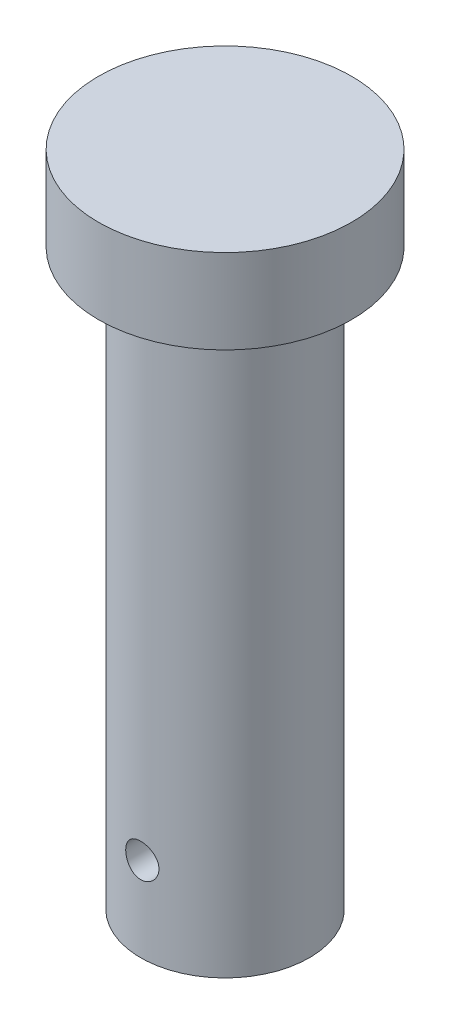
ISO-10303-21;
HEADER;
FILE_DESCRIPTION(('STEP AP214'),'2;1');
FILE_NAME('part.step','',(''),(''),'','','');
FILE_SCHEMA(('AUTOMOTIVE_DESIGN { 1 0 10303 214 1 1 1 1 }'));
ENDSEC;
DATA;
#1=APPLICATION_CONTEXT('core data for automotive mechanical design processes');
#2=APPLICATION_PROTOCOL_DEFINITION('international standard','automotive_design',2000,#1);
#3=PRODUCT_CONTEXT('',#1,'mechanical');
#4=PRODUCT('Part','Part','',(#3));
#5=PRODUCT_RELATED_PRODUCT_CATEGORY('part','',(#4));
#6=PRODUCT_DEFINITION_FORMATION('','',#4);
#7=PRODUCT_DEFINITION_CONTEXT('part definition',#1,'design');
#8=PRODUCT_DEFINITION('design','',#6,#7);
#9=PRODUCT_DEFINITION_SHAPE('','',#8);
#10=(LENGTH_UNIT() NAMED_UNIT(*) SI_UNIT(.MILLI.,.METRE.));
#11=(NAMED_UNIT(*) PLANE_ANGLE_UNIT() SI_UNIT($,.RADIAN.));
#12=(NAMED_UNIT(*) SI_UNIT($,.STERADIAN.) SOLID_ANGLE_UNIT());
#13=UNCERTAINTY_MEASURE_WITH_UNIT(LENGTH_MEASURE(1.E-05),#10,'distance_accuracy_value','');
#14=(GEOMETRIC_REPRESENTATION_CONTEXT(3) GLOBAL_UNCERTAINTY_ASSIGNED_CONTEXT((#13)) GLOBAL_UNIT_ASSIGNED_CONTEXT((#10,
#11,#12)) REPRESENTATION_CONTEXT('',''));
#15=CARTESIAN_POINT('',(0.,0.,0.));
#16=DIRECTION('',(0.,0.,1.));
#17=DIRECTION('',(1.,0.,0.));
#18=AXIS2_PLACEMENT_3D('',#15,#16,#17);
#19=CARTESIAN_POINT('',(0.,-15.,0.));
#20=DIRECTION('',(0.,1.,0.));
#21=DIRECTION('',(0.,0.,1.));
#22=AXIS2_PLACEMENT_3D('',#19,#20,#21);
#23=CYLINDRICAL_SURFACE('',#22,22.5);
#24=CARTESIAN_POINT('',(0.,-15.,0.));
#25=DIRECTION('',(0.,1.,0.));
#26=DIRECTION('',(0.,0.,1.));
#27=AXIS2_PLACEMENT_3D('',#24,#25,#26);
#28=CIRCLE('',#27,22.5);
#29=CARTESIAN_POINT('',(0.,-15.,22.5));
#30=VERTEX_POINT('',#29);
#31=EDGE_CURVE('E49',#30,#30,#28,.T.);
#32=ORIENTED_EDGE('',*,*,#31,.T.);
#33=EDGE_LOOP('',(#32));
#34=FACE_BOUND('',#33,.T.);
#35=CARTESIAN_POINT('',(0.,0.,0.));
#36=DIRECTION('',(0.,1.,0.));
#37=DIRECTION('',(0.,0.,1.));
#38=AXIS2_PLACEMENT_3D('',#35,#36,#37);
#39=CIRCLE('',#38,22.5);
#40=CARTESIAN_POINT('',(0.,0.,22.5));
#41=VERTEX_POINT('',#40);
#42=EDGE_CURVE('E54',#41,#41,#39,.T.);
#43=ORIENTED_EDGE('',*,*,#42,.F.);
#44=EDGE_LOOP('',(#43));
#45=FACE_BOUND('',#44,.T.);
#46=ADVANCED_FACE('F37',(#34,#45),#23,.T.);
#47=CARTESIAN_POINT('',(0.,-15.,0.));
#48=DIRECTION('',(0.,1.,0.));
#49=DIRECTION('',(0.,0.,1.));
#50=AXIS2_PLACEMENT_3D('',#47,#48,#49);
#51=PLANE('',#50);
#52=CARTESIAN_POINT('',(0.,-15.,0.));
#53=DIRECTION('',(0.,-1.,0.));
#54=DIRECTION('',(0.,0.,-1.));
#55=AXIS2_PLACEMENT_3D('',#52,#53,#54);
#56=CIRCLE('',#55,15.);
#57=CARTESIAN_POINT('',(0.,-15.,-15.));
#58=VERTEX_POINT('',#57);
#59=EDGE_CURVE('E10',#58,#58,#56,.T.);
#60=ORIENTED_EDGE('',*,*,#59,.F.);
#61=EDGE_LOOP('',(#60));
#62=FACE_BOUND('',#61,.T.);
#63=ORIENTED_EDGE('',*,*,#31,.F.);
#64=EDGE_LOOP('',(#63));
#65=FACE_BOUND('',#64,.T.);
#66=ADVANCED_FACE('F85',(#62,#65),#51,.F.);
#67=CARTESIAN_POINT('',(0.,0.,0.));
#68=DIRECTION('',(0.,1.,0.));
#69=DIRECTION('',(0.,0.,1.));
#70=AXIS2_PLACEMENT_3D('',#67,#68,#69);
#71=PLANE('',#70);
#72=ORIENTED_EDGE('',*,*,#42,.T.);
#73=EDGE_LOOP('',(#72));
#74=FACE_BOUND('',#73,.T.);
#75=ADVANCED_FACE('F81',(#74),#71,.T.);
#76=CARTESIAN_POINT('',(0.,-117.,0.));
#77=DIRECTION('',(0.,1.,0.));
#78=DIRECTION('',(0.,0.,1.));
#79=AXIS2_PLACEMENT_3D('',#76,#77,#78);
#80=CYLINDRICAL_SURFACE('',#79,15.);
#81=CARTESIAN_POINT('',(0.,-104.957727644723,15.));
#82=CARTESIAN_POINT('',(-0.164429762703568,-104.957721539506,14.9999969783956));
#83=CARTESIAN_POINT('',(-0.328937217951617,-104.943969531095,14.9972684973865));
#84=CARTESIAN_POINT('',(-0.653305463028808,-104.889366620122,14.98664718115));
#85=CARTESIAN_POINT('',(-0.813162399744395,-104.8484938791,14.9787501841422));
#86=CARTESIAN_POINT('',(-1.12349259764611,-104.740958574944,14.9586740107421));
#87=CARTESIAN_POINT('',(-1.27397457314733,-104.674320389779,14.9464988830924));
#88=CARTESIAN_POINT('',(-1.56161098639774,-104.517217514836,14.9191913739829));
#89=CARTESIAN_POINT('',(-1.69876628247248,-104.426754360937,14.9040591831667));
#90=CARTESIAN_POINT('',(-1.95767519049551,-104.223304857174,14.8722810668463));
#91=CARTESIAN_POINT('',(-2.07922779747335,-104.11006514638,14.8556193758809));
#92=CARTESIAN_POINT('',(-2.30174078216659,-103.86482171818,14.8227753637943));
#93=CARTESIAN_POINT('',(-2.40269958218777,-103.732816564464,14.8065930794815));
#94=CARTESIAN_POINT('',(-2.58201016361024,-103.452349378013,14.7763863160128));
#95=CARTESIAN_POINT('',(-2.66015465738132,-103.303752441489,14.7623821315543));
#96=CARTESIAN_POINT('',(-2.79029066016926,-102.99521626712,14.7383406710627));
#97=CARTESIAN_POINT('',(-2.84228467646827,-102.835278118336,14.7283030147426));
#98=CARTESIAN_POINT('',(-2.91799297600447,-102.510759485818,14.7134904297326));
#99=CARTESIAN_POINT('',(-2.94205943912988,-102.346264213014,14.7086500208323));
#100=CARTESIAN_POINT('',(-2.96232320225984,-102.015504921329,14.7045828126538));
#101=CARTESIAN_POINT('',(-2.95852327061579,-101.849241079783,14.7053554557541));
#102=CARTESIAN_POINT('',(-2.92344704313311,-101.522235075084,14.7123675309011));
#103=CARTESIAN_POINT('',(-2.89257371847963,-101.361447712127,14.7185267829031));
#104=CARTESIAN_POINT('',(-2.80486282378785,-101.047380352276,14.7354919054495));
#105=CARTESIAN_POINT('',(-2.74802404516114,-100.894100705203,14.746297992284));
#106=CARTESIAN_POINT('',(-2.60960876363205,-100.598234414841,14.7714216107408));
#107=CARTESIAN_POINT('',(-2.52787184900238,-100.455724820119,14.7857617936271));
#108=CARTESIAN_POINT('',(-2.34209375002007,-100.186292698215,14.8163231848474));
#109=CARTESIAN_POINT('',(-2.23805007126318,-100.059371916715,14.8325446034533));
#110=CARTESIAN_POINT('',(-2.00845081965847,-99.8223942982829,14.8653885424863));
#111=CARTESIAN_POINT('',(-1.88255114286223,-99.7126708648714,14.8820131189499));
#112=CARTESIAN_POINT('',(-1.61395905112776,-99.5158484692593,14.9135304483469));
#113=CARTESIAN_POINT('',(-1.47126643224587,-99.4287497818686,14.9284231802434));
#114=CARTESIAN_POINT('',(-1.17277384201991,-99.2795905203176,14.95483385433));
#115=CARTESIAN_POINT('',(-1.01695474837433,-99.2175672650864,14.9663467595141));
#116=CARTESIAN_POINT('',(-0.696831108593165,-99.1206707017916,14.9846622059237));
#117=CARTESIAN_POINT('',(-0.532527563503963,-99.0857941985607,14.9914653014824));
#118=CARTESIAN_POINT('',(-0.202964823487235,-99.0446513393358,14.999517648198));
#119=CARTESIAN_POINT('',(-0.0377647018837294,-99.0379285906137,15.0008554862988));
#120=CARTESIAN_POINT('',(0.291398500388813,-99.0520560813199,14.9980723261508));
#121=CARTESIAN_POINT('',(0.455361648074105,-99.0729048160451,14.9939516257995));
#122=CARTESIAN_POINT('',(0.775929945378207,-99.1412042187964,14.9807697678069));
#123=CARTESIAN_POINT('',(0.932586768229074,-99.1884214586134,14.9717519808725));
#124=CARTESIAN_POINT('',(1.23575982601254,-99.30786303916,14.9497832914876));
#125=CARTESIAN_POINT('',(1.38227531624742,-99.3800892140115,14.9368321005752));
#126=CARTESIAN_POINT('',(1.66293676310237,-99.5484910177694,14.9082124924983));
#127=CARTESIAN_POINT('',(1.79691409677689,-99.6449423664699,14.8925134715054));
#128=CARTESIAN_POINT('',(2.04694571408614,-99.858686537082,14.860213155956));
#129=CARTESIAN_POINT('',(2.16299813131545,-99.9759815265759,14.8436117676849));
#130=CARTESIAN_POINT('',(2.37564078883636,-100.230158458809,14.811080273944));
#131=CARTESIAN_POINT('',(2.47191813212078,-100.36730419957,14.7951637112293));
#132=CARTESIAN_POINT('',(2.64007030276637,-100.656089423476,14.7660875184461));
#133=CARTESIAN_POINT('',(2.71194609175713,-100.807728335165,14.7529277797432));
#134=CARTESIAN_POINT('',(2.82882386391464,-101.120441468184,14.7309638925047));
#135=CARTESIAN_POINT('',(2.87396307738656,-101.281462765743,14.7221375427749));
#136=CARTESIAN_POINT('',(2.93650425896489,-101.608996510998,14.7097918777426));
#137=CARTESIAN_POINT('',(2.95390973029608,-101.775508262447,14.7062718921627));
#138=CARTESIAN_POINT('',(2.96036254376128,-102.106156452043,14.7049739779993));
#139=CARTESIAN_POINT('',(2.94990410896268,-102.270283052701,14.7070959759879));
#140=CARTESIAN_POINT('',(2.90201473433925,-102.594388638095,14.7166197295045));
#141=CARTESIAN_POINT('',(2.86458399785906,-102.754367654091,14.7240214452286));
#142=CARTESIAN_POINT('',(2.76403028604823,-103.065333596948,14.7432264982441));
#143=CARTESIAN_POINT('',(2.70096628434303,-103.216340258258,14.7550197269349));
#144=CARTESIAN_POINT('',(2.55099228562529,-103.505707217763,14.7816850860109));
#145=CARTESIAN_POINT('',(2.46408036079252,-103.644066492363,14.7965574652847));
#146=CARTESIAN_POINT('',(2.2671826400287,-103.906675531526,14.8280126105233));
#147=CARTESIAN_POINT('',(2.15683928363284,-104.030654355489,14.8446195792397));
#148=CARTESIAN_POINT('',(1.91695089353176,-104.258499975465,14.8774973302073));
#149=CARTESIAN_POINT('',(1.78740145435718,-104.362362144503,14.8937680343482));
#150=CARTESIAN_POINT('',(1.51120362080295,-104.548016530209,14.9243339529687));
#151=CARTESIAN_POINT('',(1.36439543032479,-104.629574724575,14.9386075055722));
#152=CARTESIAN_POINT('',(1.05891908852499,-104.766734949452,14.9633580973518));
#153=CARTESIAN_POINT('',(0.900261884816328,-104.822360603771,14.9738385899433));
#154=CARTESIAN_POINT('',(0.617685273557066,-104.895182899716,14.9877628240101));
#155=CARTESIAN_POINT('',(0.495384830510255,-104.918595765881,14.9923251277991));
#156=CARTESIAN_POINT('',(0.248737704502875,-104.949870212072,14.9984448131895));
#157=CARTESIAN_POINT('',(0.124391083660607,-104.957732263318,15.0000022858432));
#158=CARTESIAN_POINT('',(0.,-104.957727644723,15.));
#159=B_SPLINE_CURVE_WITH_KNOTS('',3,(#81,#82,#83,#84,#85,#86,#87,#88,#89,#90,#91,#92,#93,#94,
#95,#96,#97,#98,#99,#100,#101,#102,#103,#104,#105,#106,#107,#108,#109,#110,#111,#112,#113,#114,
#115,#116,#117,#118,#119,#120,#121,#122,#123,#124,#125,#126,#127,#128,#129,#130,#131,#132,#133,
#134,#135,#136,#137,#138,#139,#140,#141,#142,#143,#144,#145,#146,#147,#148,#149,#150,#151,#152,
#153,#154,#155,#156,#157,#158),.UNSPECIFIED.,.T.,.F.,(4,2,2,2,2,2,2,2,2,2,2,2,2,2,2,2,2,2,2,2,2,
2,2,2,2,2,2,2,2,2,2,2,2,2,2,2,2,2,4),(0.,0.492834264042845,0.986065855974396,1.47883191442094,
1.97156621443524,2.47011920947099,2.96871038438328,3.47169994914731,3.97464127856723,
4.47116888255913,4.96764716031901,5.45685874578532,5.94609310442189,6.43854863220499,
6.9310592564795,7.43217529170698,7.93329741341901,8.4351626170659,8.93696874234351,
9.43060796348266,9.92422024556379,10.4135305341744,10.9028767157528,11.3980670148393,
11.893308840175,12.3958680587874,12.898407469976,13.3983446388236,13.8982186524302,
14.389285667666,14.8803489807781,15.3702888580805,15.8602683528541,16.3583447168935,
16.8565355063959,17.3597687575443,17.862542677315,18.2353830006376,18.6082120260002),.UNSPECIFIED.);
#160=CARTESIAN_POINT('',(0.,-104.957727644723,15.));
#161=VERTEX_POINT('',#160);
#162=EDGE_CURVE('E40',#161,#161,#159,.T.);
#163=ORIENTED_EDGE('',*,*,#162,.T.);
#164=EDGE_LOOP('',(#163));
#165=FACE_BOUND('',#164,.T.);
#166=CARTESIAN_POINT('',(2.95772764472291,-102.,-14.7055039757107));
#167=CARTESIAN_POINT('',(2.95772151235872,-101.835605266257,-14.7055072277227));
#168=CARTESIAN_POINT('',(2.9439751642968,-101.671132766623,-14.7082906242497));
#169=CARTESIAN_POINT('',(2.88939677329249,-101.346837103459,-14.7191076941596));
#170=CARTESIAN_POINT('',(2.84854275689802,-101.187017821622,-14.7271456267868));
#171=CARTESIAN_POINT('',(2.74106219566991,-100.876767368272,-14.7475268313589));
#172=CARTESIAN_POINT('',(2.67446090876237,-100.726327163376,-14.7598658827682));
#173=CARTESIAN_POINT('',(2.51744501134768,-100.438761162988,-14.7874540113259));
#174=CARTESIAN_POINT('',(2.42703185146071,-100.301634557127,-14.8027029111908));
#175=CARTESIAN_POINT('',(2.22363358969905,-100.04269501768,-14.8346267902051));
#176=CARTESIAN_POINT('',(2.11038390074475,-99.9210917676743,-14.851317035694));
#177=CARTESIAN_POINT('',(1.86509902445478,-99.6984805370882,-14.8841085627414));
#178=CARTESIAN_POINT('',(1.73306254100263,-99.5974739786618,-14.9002098035674));
#179=CARTESIAN_POINT('',(1.45256615847561,-99.4181120183513,-14.9301735441717));
#180=CARTESIAN_POINT('',(1.3039767419017,-99.3399555181721,-14.9440159473022));
#181=CARTESIAN_POINT('',(0.995456834880819,-99.2097952665508,-14.9677309966299));
#182=CARTESIAN_POINT('',(0.835527377604887,-99.157789136079,-14.9776040039265));
#183=CARTESIAN_POINT('',(0.511042554233899,-99.0820576261355,-14.9921599938816));
#184=CARTESIAN_POINT('',(0.346572754367269,-99.0579783049086,-14.9969078771534));
#185=CARTESIAN_POINT('',(0.0158638717917193,-99.0376799896667,-15.0009027045272));
#186=CARTESIAN_POINT('',(-0.150375043541105,-99.0414583830247,-15.0001501644848));
#187=CARTESIAN_POINT('',(-0.477472235702361,-99.0764990986108,-14.9932793248637));
#188=CARTESIAN_POINT('',(-0.638373141529377,-99.1073802027706,-14.9872354543394));
#189=CARTESIAN_POINT('',(-0.952663507568847,-99.1951454740803,-14.9705448770813));
#190=CARTESIAN_POINT('',(-1.10605267298639,-99.2520306608449,-14.9598979898651));
#191=CARTESIAN_POINT('',(-1.40205713832686,-99.390544818822,-14.9350746023641));
#192=CARTESIAN_POINT('',(-1.54460036178063,-99.4723238424606,-14.9208767934537));
#193=CARTESIAN_POINT('',(-1.81408217829891,-99.6581933433354,-14.8905178671145));
#194=CARTESIAN_POINT('',(-1.94101902120014,-99.7622863193646,-14.8743565298909));
#195=CARTESIAN_POINT('',(-2.17794630455735,-99.9919224110071,-14.841533656775));
#196=CARTESIAN_POINT('',(-2.28761311504644,-100.117799132144,-14.8248682855269));
#197=CARTESIAN_POINT('',(-2.4843319464592,-100.386324495414,-14.793175882623));
#198=CARTESIAN_POINT('',(-2.5713835632048,-100.528973437233,-14.7781488802508));
#199=CARTESIAN_POINT('',(-2.72050806187286,-100.827450498792,-14.7514275333814));
#200=CARTESIAN_POINT('',(-2.782529792507,-100.983304827057,-14.7397400275887));
#201=CARTESIAN_POINT('',(-2.87941269127652,-101.303505576366,-14.7211222708896));
#202=CARTESIAN_POINT('',(-2.91427729158976,-101.467850921497,-14.71419141884));
#203=CARTESIAN_POINT('',(-2.95537514793099,-101.797438783663,-14.7059917925037));
#204=CARTESIAN_POINT('',(-2.96207520021066,-101.962620860603,-14.704630715514));
#205=CARTESIAN_POINT('',(-2.94790876538758,-102.291742674716,-14.7074771588446));
#206=CARTESIAN_POINT('',(-2.9270437949743,-102.455682479742,-14.7116843727852));
#207=CARTESIAN_POINT('',(-2.8587416349198,-102.776105029791,-14.725107018805));
#208=CARTESIAN_POINT('',(-2.8115527745404,-102.932642848633,-14.7342756232045));
#209=CARTESIAN_POINT('',(-2.69220740769233,-103.235590335042,-14.7565470829625));
#210=CARTESIAN_POINT('',(-2.62004889375847,-103.381999187142,-14.7696502546341));
#211=CARTESIAN_POINT('',(-2.45175179030856,-103.662578513269,-14.7985224703131));
#212=CARTESIAN_POINT('',(-2.35532047035108,-103.7965700739,-14.8143232387296));
#213=CARTESIAN_POINT('',(-2.14160633393567,-104.046639600231,-14.8467227529766));
#214=CARTESIAN_POINT('',(-2.02432143429906,-104.162715774098,-14.8633215784084));
#215=CARTESIAN_POINT('',(-1.77013635022612,-104.375423410784,-14.8957458255757));
#216=CARTESIAN_POINT('',(-1.63297012208992,-104.471739641034,-14.9115560530889));
#217=CARTESIAN_POINT('',(-1.3441322317724,-104.63995996442,-14.9403594898874));
#218=CARTESIAN_POINT('',(-1.19246116793355,-104.71186506399,-14.9533528153012));
#219=CARTESIAN_POINT('',(-0.879757414369861,-104.828759662097,-14.9749934667917));
#220=CARTESIAN_POINT('',(-0.718782454108568,-104.873898925562,-14.9836649309218));
#221=CARTESIAN_POINT('',(-0.391347537330154,-104.936455855794,-14.9957882230221));
#222=CARTESIAN_POINT('',(-0.224888224404987,-104.953876763582,-14.9992406612345));
#223=CARTESIAN_POINT('',(0.105776459406181,-104.960379866901,-15.000523005487));
#224=CARTESIAN_POINT('',(0.269972320315214,-104.949936497404,-14.9984470427602));
#225=CARTESIAN_POINT('',(0.594220450132768,-104.902053090502,-14.9891032215817));
#226=CARTESIAN_POINT('',(0.754272768156698,-104.86461337325,-14.9818354247004));
#227=CARTESIAN_POINT('',(1.06540522685844,-104.764008427941,-14.9629265882197));
#228=CARTESIAN_POINT('',(1.21650392720705,-104.700898711958,-14.951294989649));
#229=CARTESIAN_POINT('',(1.50603626709698,-104.550804456797,-14.9249125156968));
#230=CARTESIAN_POINT('',(1.64446893916808,-104.463818095874,-14.9101614023216));
#231=CARTESIAN_POINT('',(1.90708973559056,-104.266831839445,-14.8788707403989));
#232=CARTESIAN_POINT('',(2.03101979866401,-104.156491745918,-14.8623067280702));
#233=CARTESIAN_POINT('',(2.2587685543338,-103.916630787099,-14.8294045042404));
#234=CARTESIAN_POINT('',(2.36258248583683,-103.787105393793,-14.8130663470424));
#235=CARTESIAN_POINT('',(2.54817667867073,-103.510933230536,-14.7822786572715));
#236=CARTESIAN_POINT('',(2.6297162110002,-103.364122198868,-14.7678505657997));
#237=CARTESIAN_POINT('',(2.76684079116723,-103.058641487174,-14.7427775611024));
#238=CARTESIAN_POINT('',(2.822449604818,-102.899982821015,-14.7321291858682));
#239=CARTESIAN_POINT('',(2.89523096286328,-102.617449455229,-14.7179687842091));
#240=CARTESIAN_POINT('',(2.91862569554854,-102.495196362829,-14.7133231696242));
#241=CARTESIAN_POINT('',(2.94987610160323,-102.248643632285,-14.7070895854962));
#242=CARTESIAN_POINT('',(2.95773228308968,-102.124344061196,-14.7055015159701));
#243=CARTESIAN_POINT('',(2.95772764472291,-102.,-14.7055039757107));
#244=B_SPLINE_CURVE_WITH_KNOTS('',3,(#166,#167,#168,#169,#170,#171,#172,#173,#174,#175,#176,
#177,#178,#179,#180,#181,#182,#183,#184,#185,#186,#187,#188,#189,#190,#191,#192,#193,#194,#195,
#196,#197,#198,#199,#200,#201,#202,#203,#204,#205,#206,#207,#208,#209,#210,#211,#212,#213,#214,
#215,#216,#217,#218,#219,#220,#221,#222,#223,#224,#225,#226,#227,#228,#229,#230,#231,#232,#233,
#234,#235,#236,#237,#238,#239,#240,#241,#242,#243),.UNSPECIFIED.,.T.,.F.,(4,2,2,2,2,2,2,2,2,2,2,
2,2,2,2,2,2,2,2,2,2,2,2,2,2,2,2,2,2,2,2,2,2,2,2,2,2,2,4),(0.,0.492728976055596,
0.985857846519529,1.47850418292867,1.97112051424421,2.46981130010515,2.96853650775338,
3.47148182572244,3.97438137996642,4.47083507090189,4.96724220267561,5.45677695888751,
5.94633091130264,6.43889622507154,6.93151672683936,7.43248527229111,7.93346277042175,
8.4354589481931,8.93739167228497,9.43097179134234,9.92452475364359,10.4134986024393,
10.9025117720097,11.397731477097,11.8930006802246,12.3956436919607,12.8982659779846,
13.3980486950708,13.8977729698137,14.3890431465077,14.8803074972709,15.3705150762895,
15.8607600676666,16.3587098050235,16.856777253736,17.3600318155276,17.8628242275321,
18.2355242778417,18.6082121405044),.UNSPECIFIED.);
#245=CARTESIAN_POINT('',(2.95772764472291,-102.,-14.7055039757107));
#246=VERTEX_POINT('',#245);
#247=EDGE_CURVE('E60',#246,#246,#244,.T.);
#248=ORIENTED_EDGE('',*,*,#247,.T.);
#249=EDGE_LOOP('',(#248));
#250=FACE_BOUND('',#249,.T.);
#251=CARTESIAN_POINT('',(0.,-117.,0.));
#252=DIRECTION('',(0.,-1.,0.));
#253=DIRECTION('',(0.,0.,-1.));
#254=AXIS2_PLACEMENT_3D('',#251,#252,#253);
#255=CIRCLE('',#254,15.);
#256=CARTESIAN_POINT('',(0.,-117.,-15.));
#257=VERTEX_POINT('',#256);
#258=EDGE_CURVE('E57',#257,#257,#255,.T.);
#259=ORIENTED_EDGE('',*,*,#258,.F.);
#260=EDGE_LOOP('',(#259));
#261=FACE_BOUND('',#260,.T.);
#262=ORIENTED_EDGE('',*,*,#59,.T.);
#263=EDGE_LOOP('',(#262));
#264=FACE_BOUND('',#263,.T.);
#265=ADVANCED_FACE('F65',(#165,#250,#261,#264),#80,.T.);
#266=CARTESIAN_POINT('',(0.,-117.,0.));
#267=DIRECTION('',(0.,-1.,0.));
#268=DIRECTION('',(0.,0.,-1.));
#269=AXIS2_PLACEMENT_3D('',#266,#267,#268);
#270=PLANE('',#269);
#271=ORIENTED_EDGE('',*,*,#258,.T.);
#272=EDGE_LOOP('',(#271));
#273=FACE_BOUND('',#272,.T.);
#274=ADVANCED_FACE('F72',(#273),#270,.T.);
#275=CARTESIAN_POINT('',(0.,-102.,-48.5));
#276=DIRECTION('',(0.,0.,1.));
#277=DIRECTION('',(1.,0.,0.));
#278=AXIS2_PLACEMENT_3D('',#275,#276,#277);
#279=CYLINDRICAL_SURFACE('',#278,2.95772764472291);
#280=ORIENTED_EDGE('',*,*,#247,.F.);
#281=EDGE_LOOP('',(#280));
#282=FACE_BOUND('',#281,.T.);
#283=ORIENTED_EDGE('',*,*,#162,.F.);
#284=EDGE_LOOP('',(#283));
#285=FACE_BOUND('',#284,.T.);
#286=ADVANCED_FACE('F69',(#282,#285),#279,.F.);
#287=CLOSED_SHELL('',(#46,#66,#75,#265,#274,#286));
#288=MANIFOLD_SOLID_BREP('B2',#287);
#289=ADVANCED_BREP_SHAPE_REPRESENTATION('',(#18,#288),#14);
#290=SHAPE_DEFINITION_REPRESENTATION(#9,#289);
ENDSEC;
END-ISO-10303-21;
